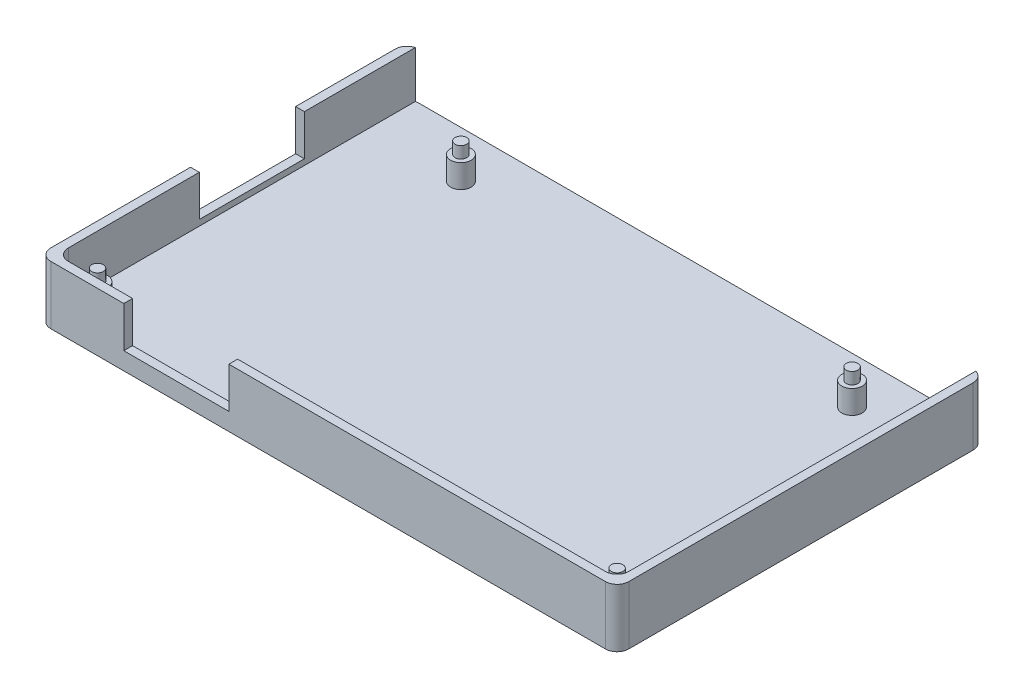
ISO-10303-21;
HEADER;
FILE_DESCRIPTION(('STEP AP214'),'2;1');
FILE_NAME('part.step','',(''),(''),'','','');
FILE_SCHEMA(('AUTOMOTIVE_DESIGN { 1 0 10303 214 1 1 1 1 }'));
ENDSEC;
DATA;
#1=APPLICATION_CONTEXT('core data for automotive mechanical design processes');
#2=APPLICATION_PROTOCOL_DEFINITION('international standard','automotive_design',2000,#1);
#3=PRODUCT_CONTEXT('',#1,'mechanical');
#4=PRODUCT('Part','Part','',(#3));
#5=PRODUCT_RELATED_PRODUCT_CATEGORY('part','',(#4));
#6=PRODUCT_DEFINITION_FORMATION('','',#4);
#7=PRODUCT_DEFINITION_CONTEXT('part definition',#1,'design');
#8=PRODUCT_DEFINITION('design','',#6,#7);
#9=PRODUCT_DEFINITION_SHAPE('','',#8);
#10=(LENGTH_UNIT() NAMED_UNIT(*) SI_UNIT(.MILLI.,.METRE.));
#11=(NAMED_UNIT(*) PLANE_ANGLE_UNIT() SI_UNIT($,.RADIAN.));
#12=(NAMED_UNIT(*) SI_UNIT($,.STERADIAN.) SOLID_ANGLE_UNIT());
#13=UNCERTAINTY_MEASURE_WITH_UNIT(LENGTH_MEASURE(1.E-05),#10,'distance_accuracy_value','');
#14=(GEOMETRIC_REPRESENTATION_CONTEXT(3) GLOBAL_UNCERTAINTY_ASSIGNED_CONTEXT((#13)) GLOBAL_UNIT_ASSIGNED_CONTEXT((#10,
#11,#12)) REPRESENTATION_CONTEXT('',''));
#15=CARTESIAN_POINT('',(0.,0.,0.));
#16=DIRECTION('',(0.,0.,1.));
#17=DIRECTION('',(1.,0.,0.));
#18=AXIS2_PLACEMENT_3D('',#15,#16,#17);
#19=CARTESIAN_POINT('',(-48.75,10.,-31.));
#20=DIRECTION('',(0.,1.,0.));
#21=DIRECTION('',(0.,0.,1.));
#22=AXIS2_PLACEMENT_3D('',#19,#20,#21);
#23=PLANE('',#22);
#24=DIRECTION('',(0.,0.,1.));
#25=VECTOR('',#24,1.);
#26=CARTESIAN_POINT('',(-36.25,10.,-33.001));
#27=LINE('',#26,#25);
#28=CARTESIAN_POINT('',(-36.25,10.,28.5));
#29=VERTEX_POINT('',#28);
#30=CARTESIAN_POINT('',(-36.25,10.,30.));
#31=VERTEX_POINT('',#30);
#32=EDGE_CURVE('E201',#29,#31,#27,.T.);
#33=ORIENTED_EDGE('',*,*,#32,.F.);
#34=DIRECTION('',(-1.,0.,0.));
#35=VECTOR('',#34,1.);
#36=CARTESIAN_POINT('',(-47.25,10.,28.5));
#37=LINE('',#36,#35);
#38=CARTESIAN_POINT('',(-47.25,10.,28.5));
#39=VERTEX_POINT('',#38);
#40=EDGE_CURVE('E206',#29,#39,#37,.T.);
#41=ORIENTED_EDGE('',*,*,#40,.T.);
#42=CARTESIAN_POINT('',(-47.25,10.,26.5));
#43=DIRECTION('',(0.,-1.,0.));
#44=DIRECTION('',(0.,0.,1.));
#45=AXIS2_PLACEMENT_3D('',#42,#43,#44);
#46=CIRCLE('',#45,2.);
#47=CARTESIAN_POINT('',(-49.25,10.,26.5));
#48=VERTEX_POINT('',#47);
#49=EDGE_CURVE('E273',#39,#48,#46,.T.);
#50=ORIENTED_EDGE('',*,*,#49,.T.);
#51=DIRECTION('',(0.,0.,-1.));
#52=VECTOR('',#51,1.);
#53=CARTESIAN_POINT('',(-49.25,10.,26.5));
#54=LINE('',#53,#52);
#55=CARTESIAN_POINT('',(-49.25,10.,4.06350832689628));
#56=VERTEX_POINT('',#55);
#57=EDGE_CURVE('E276',#48,#56,#54,.T.);
#58=ORIENTED_EDGE('',*,*,#57,.T.);
#59=DIRECTION('',(-1.,0.,0.));
#60=VECTOR('',#59,1.);
#61=CARTESIAN_POINT('',(48.251,10.,4.06350832689626));
#62=LINE('',#61,#60);
#63=CARTESIAN_POINT('',(-50.75,10.,4.06350832689628));
#64=VERTEX_POINT('',#63);
#65=EDGE_CURVE('E237',#56,#64,#62,.T.);
#66=ORIENTED_EDGE('',*,*,#65,.T.);
#67=DIRECTION('',(0.,0.,1.));
#68=VECTOR('',#67,1.);
#69=CARTESIAN_POINT('',(-50.75,10.,-31.));
#70=LINE('',#69,#68);
#71=CARTESIAN_POINT('',(-50.75,10.,28.));
#72=VERTEX_POINT('',#71);
#73=EDGE_CURVE('E246',#64,#72,#70,.T.);
#74=ORIENTED_EDGE('',*,*,#73,.T.);
#75=CARTESIAN_POINT('',(-48.75,10.,28.));
#76=DIRECTION('',(0.,1.,0.));
#77=DIRECTION('',(0.,0.,1.));
#78=AXIS2_PLACEMENT_3D('',#75,#76,#77);
#79=CIRCLE('',#78,2.);
#80=CARTESIAN_POINT('',(-48.75,10.,30.));
#81=VERTEX_POINT('',#80);
#82=EDGE_CURVE('E251',#72,#81,#79,.T.);
#83=ORIENTED_EDGE('',*,*,#82,.T.);
#84=DIRECTION('',(1.,0.,0.));
#85=VECTOR('',#84,1.);
#86=CARTESIAN_POINT('',(-48.75,10.,30.));
#87=LINE('',#86,#85);
#88=EDGE_CURVE('E255',#81,#31,#87,.T.);
#89=ORIENTED_EDGE('',*,*,#88,.T.);
#90=EDGE_LOOP('',(#33,#41,#50,#58,#66,#74,#83,#89));
#91=FACE_BOUND('',#90,.T.);
#92=ADVANCED_FACE('F34',(#91),#23,.T.);
#93=DIRECTION('',(0.,0.,1.));
#94=VECTOR('',#93,1.);
#95=CARTESIAN_POINT('',(-18.25,10.,-33.001));
#96=LINE('',#95,#94);
#97=CARTESIAN_POINT('',(-18.25,10.,28.5));
#98=VERTEX_POINT('',#97);
#99=CARTESIAN_POINT('',(-18.25,10.,30.));
#100=VERTEX_POINT('',#99);
#101=EDGE_CURVE('E215',#98,#100,#96,.T.);
#102=ORIENTED_EDGE('',*,*,#101,.T.);
#103=CARTESIAN_POINT('',(46.25,10.,30.));
#104=VERTEX_POINT('',#103);
#105=EDGE_CURVE('E254',#100,#104,#87,.T.);
#106=ORIENTED_EDGE('',*,*,#105,.T.);
#107=CARTESIAN_POINT('',(46.25,10.,28.));
#108=DIRECTION('',(0.,1.,0.));
#109=DIRECTION('',(0.,0.,1.));
#110=AXIS2_PLACEMENT_3D('',#107,#108,#109);
#111=CIRCLE('',#110,2.);
#112=CARTESIAN_POINT('',(48.25,10.,28.));
#113=VERTEX_POINT('',#112);
#114=EDGE_CURVE('E258',#104,#113,#111,.T.);
#115=ORIENTED_EDGE('',*,*,#114,.T.);
#116=DIRECTION('',(0.,0.,-1.));
#117=VECTOR('',#116,1.);
#118=CARTESIAN_POINT('',(48.25,10.,28.));
#119=LINE('',#118,#117);
#120=CARTESIAN_POINT('',(48.25,10.,-31.));
#121=VERTEX_POINT('',#120);
#122=EDGE_CURVE('E261',#113,#121,#119,.T.);
#123=ORIENTED_EDGE('',*,*,#122,.T.);
#124=CARTESIAN_POINT('',(46.25,10.,-31.));
#125=DIRECTION('',(0.,1.,0.));
#126=DIRECTION('',(0.,0.,1.));
#127=AXIS2_PLACEMENT_3D('',#124,#125,#126);
#128=CIRCLE('',#127,2.);
#129=CARTESIAN_POINT('',(46.75,10.,-32.9364916731037));
#130=VERTEX_POINT('',#129);
#131=EDGE_CURVE('E264',#121,#130,#128,.T.);
#132=ORIENTED_EDGE('',*,*,#131,.T.);
#133=DIRECTION('',(0.,0.,1.));
#134=VECTOR('',#133,1.);
#135=CARTESIAN_POINT('',(46.75,10.,26.5));
#136=LINE('',#135,#134);
#137=CARTESIAN_POINT('',(46.75,10.,26.5));
#138=VERTEX_POINT('',#137);
#139=EDGE_CURVE('E266',#130,#138,#136,.T.);
#140=ORIENTED_EDGE('',*,*,#139,.T.);
#141=CARTESIAN_POINT('',(44.75,10.,26.5));
#142=DIRECTION('',(0.,-1.,0.));
#143=DIRECTION('',(0.,0.,1.));
#144=AXIS2_PLACEMENT_3D('',#141,#142,#143);
#145=CIRCLE('',#144,2.);
#146=CARTESIAN_POINT('',(44.75,10.,28.5));
#147=VERTEX_POINT('',#146);
#148=EDGE_CURVE('E268',#138,#147,#145,.T.);
#149=ORIENTED_EDGE('',*,*,#148,.T.);
#150=EDGE_CURVE('E270',#147,#98,#37,.T.);
#151=ORIENTED_EDGE('',*,*,#150,.T.);
#152=EDGE_LOOP('',(#102,#106,#115,#123,#132,#140,#149,#151));
#153=FACE_BOUND('',#152,.T.);
#154=ADVANCED_FACE('F409',(#153),#23,.T.);
#155=CARTESIAN_POINT('',(0.,2.,0.));
#156=DIRECTION('',(0.,1.,0.));
#157=DIRECTION('',(0.,0.,1.));
#158=AXIS2_PLACEMENT_3D('',#155,#156,#157);
#159=PLANE('',#158);
#160=CARTESIAN_POINT('',(43.25,2.,25.));
#161=DIRECTION('',(0.,1.,0.));
#162=DIRECTION('',(0.,0.,1.));
#163=AXIS2_PLACEMENT_3D('',#160,#161,#162);
#164=CIRCLE('',#163,1.75);
#165=CARTESIAN_POINT('',(43.25,2.,26.75));
#166=VERTEX_POINT('',#165);
#167=EDGE_CURVE('E317',#166,#166,#164,.F.);
#168=ORIENTED_EDGE('',*,*,#167,.T.);
#169=EDGE_LOOP('',(#168));
#170=FACE_BOUND('',#169,.T.);
#171=CARTESIAN_POINT('',(-45.75,2.,25.));
#172=DIRECTION('',(0.,1.,0.));
#173=DIRECTION('',(0.,0.,1.));
#174=AXIS2_PLACEMENT_3D('',#171,#172,#173);
#175=CIRCLE('',#174,1.75);
#176=CARTESIAN_POINT('',(-45.75,2.,26.75));
#177=VERTEX_POINT('',#176);
#178=EDGE_CURVE('E329',#177,#177,#175,.F.);
#179=ORIENTED_EDGE('',*,*,#178,.T.);
#180=EDGE_LOOP('',(#179));
#181=FACE_BOUND('',#180,.T.);
#182=CARTESIAN_POINT('',(33.5,2.,-25.));
#183=DIRECTION('',(0.,1.,0.));
#184=DIRECTION('',(0.,0.,1.));
#185=AXIS2_PLACEMENT_3D('',#182,#183,#184);
#186=CIRCLE('',#185,1.75);
#187=CARTESIAN_POINT('',(33.5,2.,-23.25));
#188=VERTEX_POINT('',#187);
#189=EDGE_CURVE('E341',#188,#188,#186,.F.);
#190=ORIENTED_EDGE('',*,*,#189,.T.);
#191=EDGE_LOOP('',(#190));
#192=FACE_BOUND('',#191,.T.);
#193=CARTESIAN_POINT('',(-33.5,2.,-25.));
#194=DIRECTION('',(0.,1.,0.));
#195=DIRECTION('',(0.,0.,1.));
#196=AXIS2_PLACEMENT_3D('',#193,#194,#195);
#197=CIRCLE('',#196,1.75);
#198=CARTESIAN_POINT('',(-33.5,2.,-23.25));
#199=VERTEX_POINT('',#198);
#200=EDGE_CURVE('E350',#199,#199,#197,.T.);
#201=ORIENTED_EDGE('',*,*,#200,.F.);
#202=EDGE_LOOP('',(#201));
#203=FACE_BOUND('',#202,.T.);
#204=CARTESIAN_POINT('',(44.75,2.,26.5));
#205=DIRECTION('',(0.,-1.,0.));
#206=DIRECTION('',(0.,0.,1.));
#207=AXIS2_PLACEMENT_3D('',#204,#205,#206);
#208=CIRCLE('',#207,2.);
#209=CARTESIAN_POINT('',(46.75,2.,26.5));
#210=VERTEX_POINT('',#209);
#211=CARTESIAN_POINT('',(44.75,2.,28.5));
#212=VERTEX_POINT('',#211);
#213=EDGE_CURVE('E282',#210,#212,#208,.T.);
#214=ORIENTED_EDGE('',*,*,#213,.F.);
#215=DIRECTION('',(0.,0.,1.));
#216=VECTOR('',#215,1.);
#217=CARTESIAN_POINT('',(46.75,2.,26.5));
#218=LINE('',#217,#216);
#219=CARTESIAN_POINT('',(46.75,2.,-32.9364916731037));
#220=VERTEX_POINT('',#219);
#221=EDGE_CURVE('E242',#220,#210,#218,.T.);
#222=ORIENTED_EDGE('',*,*,#221,.F.);
#223=CARTESIAN_POINT('',(46.25,2.,-31.));
#224=DIRECTION('',(0.,1.,0.));
#225=DIRECTION('',(0.,0.,1.));
#226=AXIS2_PLACEMENT_3D('',#223,#224,#225);
#227=CIRCLE('',#226,2.);
#228=CARTESIAN_POINT('',(46.25,2.,-33.));
#229=VERTEX_POINT('',#228);
#230=EDGE_CURVE('E392',#220,#229,#227,.T.);
#231=ORIENTED_EDGE('',*,*,#230,.T.);
#232=DIRECTION('',(-1.,0.,0.));
#233=VECTOR('',#232,1.);
#234=CARTESIAN_POINT('',(-50.75,2.,-33.));
#235=LINE('',#234,#233);
#236=CARTESIAN_POINT('',(-48.75,2.,-33.));
#237=VERTEX_POINT('',#236);
#238=EDGE_CURVE('E347',#229,#237,#235,.T.);
#239=ORIENTED_EDGE('',*,*,#238,.T.);
#240=CARTESIAN_POINT('',(-48.75,2.,-31.));
#241=DIRECTION('',(0.,1.,0.));
#242=DIRECTION('',(0.,0.,1.));
#243=AXIS2_PLACEMENT_3D('',#240,#241,#242);
#244=CIRCLE('',#243,2.);
#245=CARTESIAN_POINT('',(-49.25,2.,-32.9364916731037));
#246=VERTEX_POINT('',#245);
#247=EDGE_CURVE('E394',#237,#246,#244,.T.);
#248=ORIENTED_EDGE('',*,*,#247,.T.);
#249=DIRECTION('',(0.,0.,-1.));
#250=VECTOR('',#249,1.);
#251=CARTESIAN_POINT('',(-49.25,2.,26.5));
#252=LINE('',#251,#250);
#253=CARTESIAN_POINT('',(-49.25,2.,26.5));
#254=VERTEX_POINT('',#253);
#255=EDGE_CURVE('E247',#254,#246,#252,.T.);
#256=ORIENTED_EDGE('',*,*,#255,.F.);
#257=CARTESIAN_POINT('',(-47.25,2.,26.5));
#258=DIRECTION('',(0.,-1.,0.));
#259=DIRECTION('',(0.,0.,1.));
#260=AXIS2_PLACEMENT_3D('',#257,#258,#259);
#261=CIRCLE('',#260,2.);
#262=CARTESIAN_POINT('',(-47.25,2.,28.5));
#263=VERTEX_POINT('',#262);
#264=EDGE_CURVE('E288',#263,#254,#261,.T.);
#265=ORIENTED_EDGE('',*,*,#264,.F.);
#266=DIRECTION('',(-1.,0.,0.));
#267=VECTOR('',#266,1.);
#268=CARTESIAN_POINT('',(-47.25,2.,28.5));
#269=LINE('',#268,#267);
#270=EDGE_CURVE('E285',#212,#263,#269,.T.);
#271=ORIENTED_EDGE('',*,*,#270,.F.);
#272=EDGE_LOOP('',(#214,#222,#231,#239,#248,#256,#265,#271));
#273=FACE_BOUND('',#272,.T.);
#274=ADVANCED_FACE('F449',(#170,#181,#192,#203,#273),#159,.T.);
#275=CARTESIAN_POINT('',(-33.5,8.,-25.));
#276=DIRECTION('',(0.,-1.,0.));
#277=DIRECTION('',(0.,0.,-1.));
#278=AXIS2_PLACEMENT_3D('',#275,#276,#277);
#279=CYLINDRICAL_SURFACE('',#278,0.999999999999998);
#280=CARTESIAN_POINT('',(-33.5,6.,-25.));
#281=DIRECTION('',(0.,1.,0.));
#282=DIRECTION('',(0.,0.,1.));
#283=AXIS2_PLACEMENT_3D('',#280,#281,#282);
#284=CIRCLE('',#283,0.999999999999998);
#285=CARTESIAN_POINT('',(-33.5,6.,-24.));
#286=VERTEX_POINT('',#285);
#287=EDGE_CURVE('E365',#286,#286,#284,.T.);
#288=ORIENTED_EDGE('',*,*,#287,.T.);
#289=EDGE_LOOP('',(#288));
#290=FACE_BOUND('',#289,.T.);
#291=CARTESIAN_POINT('',(-33.5,8.,-25.));
#292=DIRECTION('',(0.,1.,0.));
#293=DIRECTION('',(0.,0.,1.));
#294=AXIS2_PLACEMENT_3D('',#291,#292,#293);
#295=CIRCLE('',#294,0.999999999999998);
#296=CARTESIAN_POINT('',(-33.5,8.,-24.));
#297=VERTEX_POINT('',#296);
#298=EDGE_CURVE('E366',#297,#297,#295,.T.);
#299=ORIENTED_EDGE('',*,*,#298,.F.);
#300=EDGE_LOOP('',(#299));
#301=FACE_BOUND('',#300,.T.);
#302=ADVANCED_FACE('F550',(#290,#301),#279,.T.);
#303=CARTESIAN_POINT('',(-33.5,8.,-25.));
#304=DIRECTION('',(0.,1.,0.));
#305=DIRECTION('',(0.,0.,1.));
#306=AXIS2_PLACEMENT_3D('',#303,#304,#305);
#307=PLANE('',#306);
#308=ORIENTED_EDGE('',*,*,#298,.T.);
#309=EDGE_LOOP('',(#308));
#310=FACE_BOUND('',#309,.T.);
#311=ADVANCED_FACE('F567',(#310),#307,.T.);
#312=CARTESIAN_POINT('',(-33.5,6.,-25.));
#313=DIRECTION('',(0.,-1.,0.));
#314=DIRECTION('',(0.,0.,-1.));
#315=AXIS2_PLACEMENT_3D('',#312,#313,#314);
#316=CYLINDRICAL_SURFACE('',#315,1.75);
#317=ORIENTED_EDGE('',*,*,#200,.T.);
#318=EDGE_LOOP('',(#317));
#319=FACE_BOUND('',#318,.T.);
#320=CARTESIAN_POINT('',(-33.5,6.,-25.));
#321=DIRECTION('',(0.,1.,0.));
#322=DIRECTION('',(0.,0.,1.));
#323=AXIS2_PLACEMENT_3D('',#320,#321,#322);
#324=CIRCLE('',#323,1.75);
#325=CARTESIAN_POINT('',(-33.5,6.,-23.25));
#326=VERTEX_POINT('',#325);
#327=EDGE_CURVE('E362',#326,#326,#324,.T.);
#328=ORIENTED_EDGE('',*,*,#327,.F.);
#329=EDGE_LOOP('',(#328));
#330=FACE_BOUND('',#329,.T.);
#331=ADVANCED_FACE('F563',(#319,#330),#316,.T.);
#332=CARTESIAN_POINT('',(-33.5,6.,-25.));
#333=DIRECTION('',(0.,1.,0.));
#334=DIRECTION('',(0.,0.,1.));
#335=AXIS2_PLACEMENT_3D('',#332,#333,#334);
#336=PLANE('',#335);
#337=ORIENTED_EDGE('',*,*,#287,.F.);
#338=EDGE_LOOP('',(#337));
#339=FACE_BOUND('',#338,.T.);
#340=ORIENTED_EDGE('',*,*,#327,.T.);
#341=EDGE_LOOP('',(#340));
#342=FACE_BOUND('',#341,.T.);
#343=ADVANCED_FACE('F560',(#339,#342),#336,.T.);
#344=CARTESIAN_POINT('',(-50.75,2.,-33.));
#345=DIRECTION('',(1.,0.,0.));
#346=DIRECTION('',(0.,0.,-1.));
#347=AXIS2_PLACEMENT_3D('',#344,#345,#346);
#348=PLANE('',#347);
#349=ORIENTED_EDGE('',*,*,#73,.F.);
#350=DIRECTION('',(0.,1.,0.));
#351=VECTOR('',#350,1.);
#352=CARTESIAN_POINT('',(-50.75,10.,4.06350832689628));
#353=LINE('',#352,#351);
#354=CARTESIAN_POINT('',(-50.75,3.,4.06350832689628));
#355=VERTEX_POINT('',#354);
#356=EDGE_CURVE('E221',#355,#64,#353,.T.);
#357=ORIENTED_EDGE('',*,*,#356,.F.);
#358=DIRECTION('',(0.,0.,1.));
#359=VECTOR('',#358,1.);
#360=CARTESIAN_POINT('',(-50.75,3.,-13.9364916731037));
#361=LINE('',#360,#359);
#362=CARTESIAN_POINT('',(-50.75,3.,-13.9364916731037));
#363=VERTEX_POINT('',#362);
#364=EDGE_CURVE('E224',#363,#355,#361,.T.);
#365=ORIENTED_EDGE('',*,*,#364,.F.);
#366=DIRECTION('',(0.,-1.,0.));
#367=VECTOR('',#366,1.);
#368=CARTESIAN_POINT('',(-50.75,10.,-13.9364916731037));
#369=LINE('',#368,#367);
#370=CARTESIAN_POINT('',(-50.75,10.,-13.9364916731037));
#371=VERTEX_POINT('',#370);
#372=EDGE_CURVE('E227',#371,#363,#369,.T.);
#373=ORIENTED_EDGE('',*,*,#372,.F.);
#374=CARTESIAN_POINT('',(-50.75,10.,-31.));
#375=VERTEX_POINT('',#374);
#376=EDGE_CURVE('E248',#375,#371,#70,.T.);
#377=ORIENTED_EDGE('',*,*,#376,.F.);
#378=DIRECTION('',(0.,-1.,0.));
#379=VECTOR('',#378,1.);
#380=CARTESIAN_POINT('',(-50.75,2.,-31.));
#381=LINE('',#380,#379);
#382=CARTESIAN_POINT('',(-50.75,0.,-31.));
#383=VERTEX_POINT('',#382);
#384=EDGE_CURVE('E376',#375,#383,#381,.T.);
#385=ORIENTED_EDGE('',*,*,#384,.T.);
#386=DIRECTION('',(0.,0.,1.));
#387=VECTOR('',#386,1.);
#388=CARTESIAN_POINT('',(-50.75,0.,-33.));
#389=LINE('',#388,#387);
#390=CARTESIAN_POINT('',(-50.75,0.,28.));
#391=VERTEX_POINT('',#390);
#392=EDGE_CURVE('E346',#383,#391,#389,.T.);
#393=ORIENTED_EDGE('',*,*,#392,.T.);
#394=DIRECTION('',(0.,-1.,0.));
#395=VECTOR('',#394,1.);
#396=CARTESIAN_POINT('',(-50.75,2.,28.));
#397=LINE('',#396,#395);
#398=EDGE_CURVE('E369',#391,#72,#397,.F.);
#399=ORIENTED_EDGE('',*,*,#398,.T.);
#400=EDGE_LOOP('',(#349,#357,#365,#373,#377,#385,#393,#399));
#401=FACE_BOUND('',#400,.T.);
#402=ADVANCED_FACE('F464',(#401),#348,.F.);
#403=CARTESIAN_POINT('',(-50.75,2.,30.));
#404=DIRECTION('',(0.,0.,-1.));
#405=DIRECTION('',(-1.,0.,0.));
#406=AXIS2_PLACEMENT_3D('',#403,#404,#405);
#407=PLANE('',#406);
#408=DIRECTION('',(1.,0.,0.));
#409=VECTOR('',#408,1.);
#410=CARTESIAN_POINT('',(-36.25,3.,30.));
#411=LINE('',#410,#409);
#412=CARTESIAN_POINT('',(-36.25,3.,30.));
#413=VERTEX_POINT('',#412);
#414=CARTESIAN_POINT('',(-18.25,3.,30.));
#415=VERTEX_POINT('',#414);
#416=EDGE_CURVE('E208',#413,#415,#411,.T.);
#417=ORIENTED_EDGE('',*,*,#416,.F.);
#418=DIRECTION('',(0.,-1.,0.));
#419=VECTOR('',#418,1.);
#420=CARTESIAN_POINT('',(-36.25,3.,30.));
#421=LINE('',#420,#419);
#422=EDGE_CURVE('E189',#31,#413,#421,.T.);
#423=ORIENTED_EDGE('',*,*,#422,.F.);
#424=ORIENTED_EDGE('',*,*,#88,.F.);
#425=DIRECTION('',(0.,-1.,0.));
#426=VECTOR('',#425,1.);
#427=CARTESIAN_POINT('',(-48.75,2.,30.));
#428=LINE('',#427,#426);
#429=CARTESIAN_POINT('',(-48.75,0.,30.));
#430=VERTEX_POINT('',#429);
#431=EDGE_CURVE('E399',#81,#430,#428,.T.);
#432=ORIENTED_EDGE('',*,*,#431,.T.);
#433=DIRECTION('',(1.,0.,0.));
#434=VECTOR('',#433,1.);
#435=CARTESIAN_POINT('',(-50.75,0.,30.));
#436=LINE('',#435,#434);
#437=CARTESIAN_POINT('',(46.25,0.,30.));
#438=VERTEX_POINT('',#437);
#439=EDGE_CURVE('E354',#430,#438,#436,.T.);
#440=ORIENTED_EDGE('',*,*,#439,.T.);
#441=DIRECTION('',(0.,-1.,0.));
#442=VECTOR('',#441,1.);
#443=CARTESIAN_POINT('',(46.25,2.,30.));
#444=LINE('',#443,#442);
#445=EDGE_CURVE('E396',#438,#104,#444,.F.);
#446=ORIENTED_EDGE('',*,*,#445,.T.);
#447=ORIENTED_EDGE('',*,*,#105,.F.);
#448=DIRECTION('',(0.,1.,0.));
#449=VECTOR('',#448,1.);
#450=CARTESIAN_POINT('',(-18.25,3.,30.));
#451=LINE('',#450,#449);
#452=EDGE_CURVE('E194',#415,#100,#451,.T.);
#453=ORIENTED_EDGE('',*,*,#452,.F.);
#454=EDGE_LOOP('',(#417,#423,#424,#432,#440,#446,#447,#453));
#455=FACE_BOUND('',#454,.T.);
#456=ADVANCED_FACE('F432',(#455),#407,.F.);
#457=CARTESIAN_POINT('',(48.25,2.,-33.));
#458=DIRECTION('',(-1.,0.,0.));
#459=DIRECTION('',(0.,0.,1.));
#460=AXIS2_PLACEMENT_3D('',#457,#458,#459);
#461=PLANE('',#460);
#462=DIRECTION('',(0.,-1.,0.));
#463=VECTOR('',#462,1.);
#464=CARTESIAN_POINT('',(48.25,2.,-31.));
#465=LINE('',#464,#463);
#466=CARTESIAN_POINT('',(48.25,0.,-31.));
#467=VERTEX_POINT('',#466);
#468=EDGE_CURVE('E42',#467,#121,#465,.F.);
#469=ORIENTED_EDGE('',*,*,#468,.T.);
#470=ORIENTED_EDGE('',*,*,#122,.F.);
#471=DIRECTION('',(0.,-1.,0.));
#472=VECTOR('',#471,1.);
#473=CARTESIAN_POINT('',(48.25,2.,28.));
#474=LINE('',#473,#472);
#475=CARTESIAN_POINT('',(48.25,0.,28.));
#476=VERTEX_POINT('',#475);
#477=EDGE_CURVE('E11',#113,#476,#474,.T.);
#478=ORIENTED_EDGE('',*,*,#477,.T.);
#479=DIRECTION('',(0.,0.,-1.));
#480=VECTOR('',#479,1.);
#481=CARTESIAN_POINT('',(48.25,0.,-33.));
#482=LINE('',#481,#480);
#483=EDGE_CURVE('E357',#476,#467,#482,.T.);
#484=ORIENTED_EDGE('',*,*,#483,.T.);
#485=EDGE_LOOP('',(#469,#470,#478,#484));
#486=FACE_BOUND('',#485,.T.);
#487=ADVANCED_FACE('F404',(#486),#461,.F.);
#488=CARTESIAN_POINT('',(-50.75,2.,-33.));
#489=DIRECTION('',(0.,0.,1.));
#490=DIRECTION('',(1.,0.,0.));
#491=AXIS2_PLACEMENT_3D('',#488,#489,#490);
#492=PLANE('',#491);
#493=DIRECTION('',(-1.,0.,0.));
#494=VECTOR('',#493,1.);
#495=CARTESIAN_POINT('',(-50.75,0.,-33.));
#496=LINE('',#495,#494);
#497=CARTESIAN_POINT('',(46.25,0.,-33.));
#498=VERTEX_POINT('',#497);
#499=CARTESIAN_POINT('',(-48.75,0.,-33.));
#500=VERTEX_POINT('',#499);
#501=EDGE_CURVE('E351',#498,#500,#496,.T.);
#502=ORIENTED_EDGE('',*,*,#501,.T.);
#503=DIRECTION('',(0.,-1.,0.));
#504=VECTOR('',#503,1.);
#505=CARTESIAN_POINT('',(-48.75,2.,-33.));
#506=LINE('',#505,#504);
#507=EDGE_CURVE('E390',#500,#237,#506,.F.);
#508=ORIENTED_EDGE('',*,*,#507,.T.);
#509=ORIENTED_EDGE('',*,*,#238,.F.);
#510=DIRECTION('',(0.,-1.,0.));
#511=VECTOR('',#510,1.);
#512=CARTESIAN_POINT('',(46.25,2.,-33.));
#513=LINE('',#512,#511);
#514=EDGE_CURVE('E387',#229,#498,#513,.T.);
#515=ORIENTED_EDGE('',*,*,#514,.T.);
#516=EDGE_LOOP('',(#502,#508,#509,#515));
#517=FACE_BOUND('',#516,.T.);
#518=ADVANCED_FACE('F446',(#517),#492,.F.);
#519=CARTESIAN_POINT('',(-33.5,0.,-25.));
#520=DIRECTION('',(0.,1.,0.));
#521=DIRECTION('',(0.,0.,1.));
#522=AXIS2_PLACEMENT_3D('',#519,#520,#521);
#523=PLANE('',#522);
#524=ORIENTED_EDGE('',*,*,#392,.F.);
#525=CARTESIAN_POINT('',(-48.75,0.,-31.));
#526=DIRECTION('',(0.,1.,0.));
#527=DIRECTION('',(0.,0.,1.));
#528=AXIS2_PLACEMENT_3D('',#525,#526,#527);
#529=CIRCLE('',#528,2.);
#530=EDGE_CURVE('E385',#383,#500,#529,.F.);
#531=ORIENTED_EDGE('',*,*,#530,.T.);
#532=ORIENTED_EDGE('',*,*,#501,.F.);
#533=CARTESIAN_POINT('',(46.25,0.,-31.));
#534=DIRECTION('',(0.,1.,0.));
#535=DIRECTION('',(0.,0.,1.));
#536=AXIS2_PLACEMENT_3D('',#533,#534,#535);
#537=CIRCLE('',#536,2.);
#538=EDGE_CURVE('E379',#498,#467,#537,.F.);
#539=ORIENTED_EDGE('',*,*,#538,.T.);
#540=ORIENTED_EDGE('',*,*,#483,.F.);
#541=CARTESIAN_POINT('',(46.25,0.,28.));
#542=DIRECTION('',(0.,1.,0.));
#543=DIRECTION('',(0.,0.,1.));
#544=AXIS2_PLACEMENT_3D('',#541,#542,#543);
#545=CIRCLE('',#544,2.);
#546=EDGE_CURVE('E381',#476,#438,#545,.F.);
#547=ORIENTED_EDGE('',*,*,#546,.T.);
#548=ORIENTED_EDGE('',*,*,#439,.F.);
#549=CARTESIAN_POINT('',(-48.75,0.,28.));
#550=DIRECTION('',(0.,1.,0.));
#551=DIRECTION('',(0.,0.,1.));
#552=AXIS2_PLACEMENT_3D('',#549,#550,#551);
#553=CIRCLE('',#552,2.);
#554=EDGE_CURVE('E383',#430,#391,#553,.F.);
#555=ORIENTED_EDGE('',*,*,#554,.T.);
#556=EDGE_LOOP('',(#524,#531,#532,#539,#540,#547,#548,#555));
#557=FACE_BOUND('',#556,.T.);
#558=ADVANCED_FACE('F442',(#557),#523,.F.);
#559=CARTESIAN_POINT('',(33.5,8.,-25.));
#560=DIRECTION('',(0.,-1.,0.));
#561=DIRECTION('',(0.,0.,-1.));
#562=AXIS2_PLACEMENT_3D('',#559,#560,#561);
#563=CYLINDRICAL_SURFACE('',#562,0.999999999999998);
#564=CARTESIAN_POINT('',(33.5,6.,-25.));
#565=DIRECTION('',(0.,1.,0.));
#566=DIRECTION('',(0.,0.,1.));
#567=AXIS2_PLACEMENT_3D('',#564,#565,#566);
#568=CIRCLE('',#567,0.999999999999998);
#569=CARTESIAN_POINT('',(33.5,6.,-24.));
#570=VERTEX_POINT('',#569);
#571=EDGE_CURVE('E337',#570,#570,#568,.T.);
#572=ORIENTED_EDGE('',*,*,#571,.T.);
#573=EDGE_LOOP('',(#572));
#574=FACE_BOUND('',#573,.T.);
#575=CARTESIAN_POINT('',(33.5,8.,-25.));
#576=DIRECTION('',(0.,1.,0.));
#577=DIRECTION('',(0.,0.,1.));
#578=AXIS2_PLACEMENT_3D('',#575,#576,#577);
#579=CIRCLE('',#578,0.999999999999998);
#580=CARTESIAN_POINT('',(33.5,8.,-24.));
#581=VERTEX_POINT('',#580);
#582=EDGE_CURVE('E338',#581,#581,#579,.T.);
#583=ORIENTED_EDGE('',*,*,#582,.F.);
#584=EDGE_LOOP('',(#583));
#585=FACE_BOUND('',#584,.T.);
#586=ADVANCED_FACE('F543',(#574,#585),#563,.T.);
#587=CARTESIAN_POINT('',(33.5,8.,-25.));
#588=DIRECTION('',(0.,1.,0.));
#589=DIRECTION('',(0.,0.,1.));
#590=AXIS2_PLACEMENT_3D('',#587,#588,#589);
#591=PLANE('',#590);
#592=ORIENTED_EDGE('',*,*,#582,.T.);
#593=EDGE_LOOP('',(#592));
#594=FACE_BOUND('',#593,.T.);
#595=ADVANCED_FACE('F539',(#594),#591,.T.);
#596=CARTESIAN_POINT('',(33.5,6.,-25.));
#597=DIRECTION('',(0.,-1.,0.));
#598=DIRECTION('',(0.,0.,-1.));
#599=AXIS2_PLACEMENT_3D('',#596,#597,#598);
#600=CYLINDRICAL_SURFACE('',#599,1.75);
#601=ORIENTED_EDGE('',*,*,#189,.F.);
#602=EDGE_LOOP('',(#601));
#603=FACE_BOUND('',#602,.T.);
#604=CARTESIAN_POINT('',(33.5,6.,-25.));
#605=DIRECTION('',(0.,1.,0.));
#606=DIRECTION('',(0.,0.,1.));
#607=AXIS2_PLACEMENT_3D('',#604,#605,#606);
#608=CIRCLE('',#607,1.75);
#609=CARTESIAN_POINT('',(33.5,6.,-23.25));
#610=VERTEX_POINT('',#609);
#611=EDGE_CURVE('E334',#610,#610,#608,.T.);
#612=ORIENTED_EDGE('',*,*,#611,.F.);
#613=EDGE_LOOP('',(#612));
#614=FACE_BOUND('',#613,.T.);
#615=ADVANCED_FACE('F535',(#603,#614),#600,.T.);
#616=CARTESIAN_POINT('',(33.5,6.,-25.));
#617=DIRECTION('',(0.,1.,0.));
#618=DIRECTION('',(0.,0.,1.));
#619=AXIS2_PLACEMENT_3D('',#616,#617,#618);
#620=PLANE('',#619);
#621=ORIENTED_EDGE('',*,*,#571,.F.);
#622=EDGE_LOOP('',(#621));
#623=FACE_BOUND('',#622,.T.);
#624=ORIENTED_EDGE('',*,*,#611,.T.);
#625=EDGE_LOOP('',(#624));
#626=FACE_BOUND('',#625,.T.);
#627=ADVANCED_FACE('F531',(#623,#626),#620,.T.);
#628=CARTESIAN_POINT('',(-45.75,8.,25.));
#629=DIRECTION('',(0.,-1.,0.));
#630=DIRECTION('',(0.,0.,-1.));
#631=AXIS2_PLACEMENT_3D('',#628,#629,#630);
#632=CYLINDRICAL_SURFACE('',#631,0.999999999999998);
#633=CARTESIAN_POINT('',(-45.75,6.,25.));
#634=DIRECTION('',(0.,1.,0.));
#635=DIRECTION('',(0.,0.,1.));
#636=AXIS2_PLACEMENT_3D('',#633,#634,#635);
#637=CIRCLE('',#636,0.999999999999998);
#638=CARTESIAN_POINT('',(-45.75,6.,26.));
#639=VERTEX_POINT('',#638);
#640=EDGE_CURVE('E325',#639,#639,#637,.T.);
#641=ORIENTED_EDGE('',*,*,#640,.T.);
#642=EDGE_LOOP('',(#641));
#643=FACE_BOUND('',#642,.T.);
#644=CARTESIAN_POINT('',(-45.75,8.,25.));
#645=DIRECTION('',(0.,1.,0.));
#646=DIRECTION('',(0.,0.,1.));
#647=AXIS2_PLACEMENT_3D('',#644,#645,#646);
#648=CIRCLE('',#647,0.999999999999998);
#649=CARTESIAN_POINT('',(-45.75,8.,26.));
#650=VERTEX_POINT('',#649);
#651=EDGE_CURVE('E326',#650,#650,#648,.T.);
#652=ORIENTED_EDGE('',*,*,#651,.F.);
#653=EDGE_LOOP('',(#652));
#654=FACE_BOUND('',#653,.T.);
#655=ADVANCED_FACE('F527',(#643,#654),#632,.T.);
#656=CARTESIAN_POINT('',(-45.75,8.,25.));
#657=DIRECTION('',(0.,1.,0.));
#658=DIRECTION('',(0.,0.,1.));
#659=AXIS2_PLACEMENT_3D('',#656,#657,#658);
#660=PLANE('',#659);
#661=ORIENTED_EDGE('',*,*,#651,.T.);
#662=EDGE_LOOP('',(#661));
#663=FACE_BOUND('',#662,.T.);
#664=ADVANCED_FACE('F523',(#663),#660,.T.);
#665=CARTESIAN_POINT('',(-45.75,6.,25.));
#666=DIRECTION('',(0.,-1.,0.));
#667=DIRECTION('',(0.,0.,-1.));
#668=AXIS2_PLACEMENT_3D('',#665,#666,#667);
#669=CYLINDRICAL_SURFACE('',#668,1.75);
#670=ORIENTED_EDGE('',*,*,#178,.F.);
#671=EDGE_LOOP('',(#670));
#672=FACE_BOUND('',#671,.T.);
#673=CARTESIAN_POINT('',(-45.75,6.,25.));
#674=DIRECTION('',(0.,1.,0.));
#675=DIRECTION('',(0.,0.,1.));
#676=AXIS2_PLACEMENT_3D('',#673,#674,#675);
#677=CIRCLE('',#676,1.75);
#678=CARTESIAN_POINT('',(-45.75,6.,26.75));
#679=VERTEX_POINT('',#678);
#680=EDGE_CURVE('E322',#679,#679,#677,.T.);
#681=ORIENTED_EDGE('',*,*,#680,.F.);
#682=EDGE_LOOP('',(#681));
#683=FACE_BOUND('',#682,.T.);
#684=ADVANCED_FACE('F519',(#672,#683),#669,.T.);
#685=CARTESIAN_POINT('',(-45.75,6.,25.));
#686=DIRECTION('',(0.,1.,0.));
#687=DIRECTION('',(0.,0.,1.));
#688=AXIS2_PLACEMENT_3D('',#685,#686,#687);
#689=PLANE('',#688);
#690=ORIENTED_EDGE('',*,*,#640,.F.);
#691=EDGE_LOOP('',(#690));
#692=FACE_BOUND('',#691,.T.);
#693=ORIENTED_EDGE('',*,*,#680,.T.);
#694=EDGE_LOOP('',(#693));
#695=FACE_BOUND('',#694,.T.);
#696=ADVANCED_FACE('F515',(#692,#695),#689,.T.);
#697=CARTESIAN_POINT('',(43.25,8.,25.));
#698=DIRECTION('',(0.,-1.,0.));
#699=DIRECTION('',(0.,0.,-1.));
#700=AXIS2_PLACEMENT_3D('',#697,#698,#699);
#701=CYLINDRICAL_SURFACE('',#700,0.999999999999998);
#702=CARTESIAN_POINT('',(43.25,6.,25.));
#703=DIRECTION('',(0.,1.,0.));
#704=DIRECTION('',(0.,0.,1.));
#705=AXIS2_PLACEMENT_3D('',#702,#703,#704);
#706=CIRCLE('',#705,0.999999999999998);
#707=CARTESIAN_POINT('',(43.25,6.,26.));
#708=VERTEX_POINT('',#707);
#709=EDGE_CURVE('E313',#708,#708,#706,.T.);
#710=ORIENTED_EDGE('',*,*,#709,.T.);
#711=EDGE_LOOP('',(#710));
#712=FACE_BOUND('',#711,.T.);
#713=CARTESIAN_POINT('',(43.25,8.,25.));
#714=DIRECTION('',(0.,1.,0.));
#715=DIRECTION('',(0.,0.,1.));
#716=AXIS2_PLACEMENT_3D('',#713,#714,#715);
#717=CIRCLE('',#716,0.999999999999998);
#718=CARTESIAN_POINT('',(43.25,8.,26.));
#719=VERTEX_POINT('',#718);
#720=EDGE_CURVE('E314',#719,#719,#717,.T.);
#721=ORIENTED_EDGE('',*,*,#720,.F.);
#722=EDGE_LOOP('',(#721));
#723=FACE_BOUND('',#722,.T.);
#724=ADVANCED_FACE('F511',(#712,#723),#701,.T.);
#725=CARTESIAN_POINT('',(43.25,8.,25.));
#726=DIRECTION('',(0.,1.,0.));
#727=DIRECTION('',(0.,0.,1.));
#728=AXIS2_PLACEMENT_3D('',#725,#726,#727);
#729=PLANE('',#728);
#730=ORIENTED_EDGE('',*,*,#720,.T.);
#731=EDGE_LOOP('',(#730));
#732=FACE_BOUND('',#731,.T.);
#733=ADVANCED_FACE('F507',(#732),#729,.T.);
#734=CARTESIAN_POINT('',(43.25,6.,25.));
#735=DIRECTION('',(0.,-1.,0.));
#736=DIRECTION('',(0.,0.,-1.));
#737=AXIS2_PLACEMENT_3D('',#734,#735,#736);
#738=CYLINDRICAL_SURFACE('',#737,1.75);
#739=ORIENTED_EDGE('',*,*,#167,.F.);
#740=EDGE_LOOP('',(#739));
#741=FACE_BOUND('',#740,.T.);
#742=CARTESIAN_POINT('',(43.25,6.,25.));
#743=DIRECTION('',(0.,1.,0.));
#744=DIRECTION('',(0.,0.,1.));
#745=AXIS2_PLACEMENT_3D('',#742,#743,#744);
#746=CIRCLE('',#745,1.75);
#747=CARTESIAN_POINT('',(43.25,6.,26.75));
#748=VERTEX_POINT('',#747);
#749=EDGE_CURVE('E310',#748,#748,#746,.T.);
#750=ORIENTED_EDGE('',*,*,#749,.F.);
#751=EDGE_LOOP('',(#750));
#752=FACE_BOUND('',#751,.T.);
#753=ADVANCED_FACE('F503',(#741,#752),#738,.T.);
#754=CARTESIAN_POINT('',(43.25,6.,25.));
#755=DIRECTION('',(0.,1.,0.));
#756=DIRECTION('',(0.,0.,1.));
#757=AXIS2_PLACEMENT_3D('',#754,#755,#756);
#758=PLANE('',#757);
#759=ORIENTED_EDGE('',*,*,#709,.F.);
#760=EDGE_LOOP('',(#759));
#761=FACE_BOUND('',#760,.T.);
#762=ORIENTED_EDGE('',*,*,#749,.T.);
#763=EDGE_LOOP('',(#762));
#764=FACE_BOUND('',#763,.T.);
#765=ADVANCED_FACE('F500',(#761,#764),#758,.T.);
#766=CARTESIAN_POINT('',(-48.75,2.,-31.));
#767=DIRECTION('',(0.,-1.,0.));
#768=DIRECTION('',(0.,0.,-1.));
#769=AXIS2_PLACEMENT_3D('',#766,#767,#768);
#770=CYLINDRICAL_SURFACE('',#769,2.);
#771=ORIENTED_EDGE('',*,*,#247,.F.);
#772=ORIENTED_EDGE('',*,*,#507,.F.);
#773=ORIENTED_EDGE('',*,*,#530,.F.);
#774=ORIENTED_EDGE('',*,*,#384,.F.);
#775=CARTESIAN_POINT('',(-48.75,10.,-31.));
#776=DIRECTION('',(0.,1.,0.));
#777=DIRECTION('',(0.,0.,1.));
#778=AXIS2_PLACEMENT_3D('',#775,#776,#777);
#779=CIRCLE('',#778,2.00000000000001);
#780=CARTESIAN_POINT('',(-49.25,10.,-32.9364916731037));
#781=VERTEX_POINT('',#780);
#782=EDGE_CURVE('E243',#781,#375,#779,.T.);
#783=ORIENTED_EDGE('',*,*,#782,.F.);
#784=DIRECTION('',(0.,-1.,0.));
#785=VECTOR('',#784,1.);
#786=CARTESIAN_POINT('',(-49.25,10.,-32.9364916731037));
#787=LINE('',#786,#785);
#788=EDGE_CURVE('E279',#781,#246,#787,.T.);
#789=ORIENTED_EDGE('',*,*,#788,.T.);
#790=EDGE_LOOP('',(#771,#772,#773,#774,#783,#789));
#791=FACE_BOUND('',#790,.T.);
#792=ADVANCED_FACE('F451',(#791),#770,.T.);
#793=CARTESIAN_POINT('',(-48.75,2.,28.));
#794=DIRECTION('',(0.,-1.,0.));
#795=DIRECTION('',(0.,0.,-1.));
#796=AXIS2_PLACEMENT_3D('',#793,#794,#795);
#797=CYLINDRICAL_SURFACE('',#796,2.);
#798=ORIENTED_EDGE('',*,*,#431,.F.);
#799=ORIENTED_EDGE('',*,*,#82,.F.);
#800=ORIENTED_EDGE('',*,*,#398,.F.);
#801=ORIENTED_EDGE('',*,*,#554,.F.);
#802=EDGE_LOOP('',(#798,#799,#800,#801));
#803=FACE_BOUND('',#802,.T.);
#804=ADVANCED_FACE('F469',(#803),#797,.T.);
#805=CARTESIAN_POINT('',(46.25,2.,28.));
#806=DIRECTION('',(0.,-1.,0.));
#807=DIRECTION('',(0.,0.,-1.));
#808=AXIS2_PLACEMENT_3D('',#805,#806,#807);
#809=CYLINDRICAL_SURFACE('',#808,2.);
#810=ORIENTED_EDGE('',*,*,#477,.F.);
#811=ORIENTED_EDGE('',*,*,#114,.F.);
#812=ORIENTED_EDGE('',*,*,#445,.F.);
#813=ORIENTED_EDGE('',*,*,#546,.F.);
#814=EDGE_LOOP('',(#810,#811,#812,#813));
#815=FACE_BOUND('',#814,.T.);
#816=ADVANCED_FACE('F439',(#815),#809,.T.);
#817=CARTESIAN_POINT('',(46.25,2.,-31.));
#818=DIRECTION('',(0.,-1.,0.));
#819=DIRECTION('',(0.,0.,-1.));
#820=AXIS2_PLACEMENT_3D('',#817,#818,#819);
#821=CYLINDRICAL_SURFACE('',#820,2.);
#822=ORIENTED_EDGE('',*,*,#230,.F.);
#823=DIRECTION('',(0.,-1.,0.));
#824=VECTOR('',#823,1.);
#825=CARTESIAN_POINT('',(46.75,10.,-32.9364916731037));
#826=LINE('',#825,#824);
#827=EDGE_CURVE('E307',#130,#220,#826,.T.);
#828=ORIENTED_EDGE('',*,*,#827,.F.);
#829=ORIENTED_EDGE('',*,*,#131,.F.);
#830=ORIENTED_EDGE('',*,*,#468,.F.);
#831=ORIENTED_EDGE('',*,*,#538,.F.);
#832=ORIENTED_EDGE('',*,*,#514,.F.);
#833=EDGE_LOOP('',(#822,#828,#829,#830,#831,#832));
#834=FACE_BOUND('',#833,.T.);
#835=ADVANCED_FACE('F36',(#834),#821,.T.);
#836=CARTESIAN_POINT('',(46.75,10.,26.5));
#837=DIRECTION('',(1.,0.,0.));
#838=DIRECTION('',(0.,0.,-1.));
#839=AXIS2_PLACEMENT_3D('',#836,#837,#838);
#840=PLANE('',#839);
#841=ORIENTED_EDGE('',*,*,#221,.T.);
#842=DIRECTION('',(0.,-1.,0.));
#843=VECTOR('',#842,1.);
#844=CARTESIAN_POINT('',(46.75,10.,26.5));
#845=LINE('',#844,#843);
#846=EDGE_CURVE('E304',#138,#210,#845,.T.);
#847=ORIENTED_EDGE('',*,*,#846,.F.);
#848=ORIENTED_EDGE('',*,*,#139,.F.);
#849=ORIENTED_EDGE('',*,*,#827,.T.);
#850=EDGE_LOOP('',(#841,#847,#848,#849));
#851=FACE_BOUND('',#850,.T.);
#852=ADVANCED_FACE('F417',(#851),#840,.F.);
#853=CARTESIAN_POINT('',(44.75,10.,26.5));
#854=DIRECTION('',(0.,-1.,0.));
#855=DIRECTION('',(0.,0.,-1.));
#856=AXIS2_PLACEMENT_3D('',#853,#854,#855);
#857=CYLINDRICAL_SURFACE('',#856,2.);
#858=ORIENTED_EDGE('',*,*,#213,.T.);
#859=DIRECTION('',(0.,-1.,0.));
#860=VECTOR('',#859,1.);
#861=CARTESIAN_POINT('',(44.75,10.,28.5));
#862=LINE('',#861,#860);
#863=EDGE_CURVE('E301',#147,#212,#862,.T.);
#864=ORIENTED_EDGE('',*,*,#863,.F.);
#865=ORIENTED_EDGE('',*,*,#148,.F.);
#866=ORIENTED_EDGE('',*,*,#846,.T.);
#867=EDGE_LOOP('',(#858,#864,#865,#866));
#868=FACE_BOUND('',#867,.T.);
#869=ADVANCED_FACE('F422',(#868),#857,.F.);
#870=CARTESIAN_POINT('',(-47.25,10.,28.5));
#871=DIRECTION('',(0.,0.,1.));
#872=DIRECTION('',(1.,0.,0.));
#873=AXIS2_PLACEMENT_3D('',#870,#871,#872);
#874=PLANE('',#873);
#875=ORIENTED_EDGE('',*,*,#40,.F.);
#876=DIRECTION('',(0.,1.,0.));
#877=VECTOR('',#876,1.);
#878=CARTESIAN_POINT('',(-36.25,3.,28.5));
#879=LINE('',#878,#877);
#880=CARTESIAN_POINT('',(-36.25,3.,28.5));
#881=VERTEX_POINT('',#880);
#882=EDGE_CURVE('E186',#881,#29,#879,.T.);
#883=ORIENTED_EDGE('',*,*,#882,.F.);
#884=DIRECTION('',(-1.,0.,0.));
#885=VECTOR('',#884,1.);
#886=CARTESIAN_POINT('',(-36.25,3.,28.5));
#887=LINE('',#886,#885);
#888=CARTESIAN_POINT('',(-18.25,3.,28.5));
#889=VERTEX_POINT('',#888);
#890=EDGE_CURVE('E197',#889,#881,#887,.T.);
#891=ORIENTED_EDGE('',*,*,#890,.F.);
#892=DIRECTION('',(0.,-1.,0.));
#893=VECTOR('',#892,1.);
#894=CARTESIAN_POINT('',(-18.25,3.,28.5));
#895=LINE('',#894,#893);
#896=EDGE_CURVE('E49',#98,#889,#895,.T.);
#897=ORIENTED_EDGE('',*,*,#896,.F.);
#898=ORIENTED_EDGE('',*,*,#150,.F.);
#899=ORIENTED_EDGE('',*,*,#863,.T.);
#900=ORIENTED_EDGE('',*,*,#270,.T.);
#901=DIRECTION('',(0.,-1.,0.));
#902=VECTOR('',#901,1.);
#903=CARTESIAN_POINT('',(-47.25,10.,28.5));
#904=LINE('',#903,#902);
#905=EDGE_CURVE('E298',#39,#263,#904,.T.);
#906=ORIENTED_EDGE('',*,*,#905,.F.);
#907=EDGE_LOOP('',(#875,#883,#891,#897,#898,#899,#900,#906));
#908=FACE_BOUND('',#907,.T.);
#909=ADVANCED_FACE('F204',(#908),#874,.F.);
#910=CARTESIAN_POINT('',(-47.25,10.,26.5));
#911=DIRECTION('',(0.,-1.,0.));
#912=DIRECTION('',(0.,0.,-1.));
#913=AXIS2_PLACEMENT_3D('',#910,#911,#912);
#914=CYLINDRICAL_SURFACE('',#913,2.);
#915=ORIENTED_EDGE('',*,*,#264,.T.);
#916=DIRECTION('',(0.,-1.,0.));
#917=VECTOR('',#916,1.);
#918=CARTESIAN_POINT('',(-49.25,10.,26.5));
#919=LINE('',#918,#917);
#920=EDGE_CURVE('E295',#48,#254,#919,.T.);
#921=ORIENTED_EDGE('',*,*,#920,.F.);
#922=ORIENTED_EDGE('',*,*,#49,.F.);
#923=ORIENTED_EDGE('',*,*,#905,.T.);
#924=EDGE_LOOP('',(#915,#921,#922,#923));
#925=FACE_BOUND('',#924,.T.);
#926=ADVANCED_FACE('F426',(#925),#914,.F.);
#927=CARTESIAN_POINT('',(-49.25,10.,26.5));
#928=DIRECTION('',(-1.,0.,0.));
#929=DIRECTION('',(0.,0.,1.));
#930=AXIS2_PLACEMENT_3D('',#927,#928,#929);
#931=PLANE('',#930);
#932=DIRECTION('',(0.,0.,-1.));
#933=VECTOR('',#932,1.);
#934=CARTESIAN_POINT('',(-49.25,3.,-13.9364916731037));
#935=LINE('',#934,#933);
#936=CARTESIAN_POINT('',(-49.25,3.,4.06350832689628));
#937=VERTEX_POINT('',#936);
#938=CARTESIAN_POINT('',(-49.25,3.,-13.9364916731037));
#939=VERTEX_POINT('',#938);
#940=EDGE_CURVE('E200',#937,#939,#935,.T.);
#941=ORIENTED_EDGE('',*,*,#940,.F.);
#942=DIRECTION('',(0.,-1.,0.));
#943=VECTOR('',#942,1.);
#944=CARTESIAN_POINT('',(-49.25,10.,4.06350832689628));
#945=LINE('',#944,#943);
#946=EDGE_CURVE('E230',#56,#937,#945,.T.);
#947=ORIENTED_EDGE('',*,*,#946,.F.);
#948=ORIENTED_EDGE('',*,*,#57,.F.);
#949=ORIENTED_EDGE('',*,*,#920,.T.);
#950=ORIENTED_EDGE('',*,*,#255,.T.);
#951=ORIENTED_EDGE('',*,*,#788,.F.);
#952=CARTESIAN_POINT('',(-49.25,10.,-13.9364916731037));
#953=VERTEX_POINT('',#952);
#954=EDGE_CURVE('E275',#953,#781,#54,.T.);
#955=ORIENTED_EDGE('',*,*,#954,.F.);
#956=DIRECTION('',(0.,1.,0.));
#957=VECTOR('',#956,1.);
#958=CARTESIAN_POINT('',(-49.25,10.,-13.9364916731037));
#959=LINE('',#958,#957);
#960=EDGE_CURVE('E57',#939,#953,#959,.T.);
#961=ORIENTED_EDGE('',*,*,#960,.F.);
#962=EDGE_LOOP('',(#941,#947,#948,#949,#950,#951,#955,#961));
#963=FACE_BOUND('',#962,.T.);
#964=ADVANCED_FACE('F457',(#963),#931,.F.);
#965=DIRECTION('',(-1.,0.,0.));
#966=VECTOR('',#965,1.);
#967=CARTESIAN_POINT('',(48.251,10.,-13.9364916731037));
#968=LINE('',#967,#966);
#969=EDGE_CURVE('E234',#953,#371,#968,.T.);
#970=ORIENTED_EDGE('',*,*,#969,.F.);
#971=ORIENTED_EDGE('',*,*,#954,.T.);
#972=ORIENTED_EDGE('',*,*,#782,.T.);
#973=ORIENTED_EDGE('',*,*,#376,.T.);
#974=EDGE_LOOP('',(#970,#971,#972,#973));
#975=FACE_BOUND('',#974,.T.);
#976=ADVANCED_FACE('F473',(#975),#23,.T.);
#977=CARTESIAN_POINT('',(48.251,3.,-13.9364916731037));
#978=DIRECTION('',(0.,-1.,0.));
#979=DIRECTION('',(0.,0.,-1.));
#980=AXIS2_PLACEMENT_3D('',#977,#978,#979);
#981=PLANE('',#980);
#982=ORIENTED_EDGE('',*,*,#940,.T.);
#983=DIRECTION('',(-1.,0.,0.));
#984=VECTOR('',#983,1.);
#985=CARTESIAN_POINT('',(48.251,3.,-13.9364916731037));
#986=LINE('',#985,#984);
#987=EDGE_CURVE('E236',#939,#363,#986,.T.);
#988=ORIENTED_EDGE('',*,*,#987,.T.);
#989=ORIENTED_EDGE('',*,*,#364,.T.);
#990=DIRECTION('',(-1.,0.,0.));
#991=VECTOR('',#990,1.);
#992=CARTESIAN_POINT('',(48.251,3.,4.06350832689626));
#993=LINE('',#992,#991);
#994=EDGE_CURVE('E223',#937,#355,#993,.T.);
#995=ORIENTED_EDGE('',*,*,#994,.F.);
#996=EDGE_LOOP('',(#982,#988,#989,#995));
#997=FACE_BOUND('',#996,.T.);
#998=ADVANCED_FACE('F476',(#997),#981,.F.);
#999=CARTESIAN_POINT('',(48.251,10.,4.06350832689626));
#1000=DIRECTION('',(0.,0.,1.));
#1001=DIRECTION('',(1.,0.,0.));
#1002=AXIS2_PLACEMENT_3D('',#999,#1000,#1001);
#1003=PLANE('',#1002);
#1004=ORIENTED_EDGE('',*,*,#946,.T.);
#1005=ORIENTED_EDGE('',*,*,#994,.T.);
#1006=ORIENTED_EDGE('',*,*,#356,.T.);
#1007=ORIENTED_EDGE('',*,*,#65,.F.);
#1008=EDGE_LOOP('',(#1004,#1005,#1006,#1007));
#1009=FACE_BOUND('',#1008,.T.);
#1010=ADVANCED_FACE('F460',(#1009),#1003,.F.);
#1011=CARTESIAN_POINT('',(48.251,10.,-13.9364916731037));
#1012=DIRECTION('',(0.,0.,-1.));
#1013=DIRECTION('',(-1.,0.,0.));
#1014=AXIS2_PLACEMENT_3D('',#1011,#1012,#1013);
#1015=PLANE('',#1014);
#1016=ORIENTED_EDGE('',*,*,#960,.T.);
#1017=ORIENTED_EDGE('',*,*,#969,.T.);
#1018=ORIENTED_EDGE('',*,*,#372,.T.);
#1019=ORIENTED_EDGE('',*,*,#987,.F.);
#1020=EDGE_LOOP('',(#1016,#1017,#1018,#1019));
#1021=FACE_BOUND('',#1020,.T.);
#1022=ADVANCED_FACE('F474',(#1021),#1015,.F.);
#1023=CARTESIAN_POINT('',(-36.25,3.,-33.001));
#1024=DIRECTION('',(-1.,0.,0.));
#1025=DIRECTION('',(0.,0.,1.));
#1026=AXIS2_PLACEMENT_3D('',#1023,#1024,#1025);
#1027=PLANE('',#1026);
#1028=ORIENTED_EDGE('',*,*,#882,.T.);
#1029=ORIENTED_EDGE('',*,*,#32,.T.);
#1030=ORIENTED_EDGE('',*,*,#422,.T.);
#1031=DIRECTION('',(0.,0.,1.));
#1032=VECTOR('',#1031,1.);
#1033=CARTESIAN_POINT('',(-36.25,3.,-33.001));
#1034=LINE('',#1033,#1032);
#1035=EDGE_CURVE('E182',#881,#413,#1034,.T.);
#1036=ORIENTED_EDGE('',*,*,#1035,.F.);
#1037=EDGE_LOOP('',(#1028,#1029,#1030,#1036));
#1038=FACE_BOUND('',#1037,.T.);
#1039=ADVANCED_FACE('F184',(#1038),#1027,.F.);
#1040=CARTESIAN_POINT('',(-18.25,3.,-33.001));
#1041=DIRECTION('',(1.,0.,0.));
#1042=DIRECTION('',(0.,0.,-1.));
#1043=AXIS2_PLACEMENT_3D('',#1040,#1041,#1042);
#1044=PLANE('',#1043);
#1045=ORIENTED_EDGE('',*,*,#896,.T.);
#1046=DIRECTION('',(0.,0.,1.));
#1047=VECTOR('',#1046,1.);
#1048=CARTESIAN_POINT('',(-18.25,3.,-33.001));
#1049=LINE('',#1048,#1047);
#1050=EDGE_CURVE('E193',#889,#415,#1049,.T.);
#1051=ORIENTED_EDGE('',*,*,#1050,.T.);
#1052=ORIENTED_EDGE('',*,*,#452,.T.);
#1053=ORIENTED_EDGE('',*,*,#101,.F.);
#1054=EDGE_LOOP('',(#1045,#1051,#1052,#1053));
#1055=FACE_BOUND('',#1054,.T.);
#1056=ADVANCED_FACE('F435',(#1055),#1044,.F.);
#1057=CARTESIAN_POINT('',(-36.25,3.,-33.001));
#1058=DIRECTION('',(0.,-1.,0.));
#1059=DIRECTION('',(0.,0.,-1.));
#1060=AXIS2_PLACEMENT_3D('',#1057,#1058,#1059);
#1061=PLANE('',#1060);
#1062=ORIENTED_EDGE('',*,*,#890,.T.);
#1063=ORIENTED_EDGE('',*,*,#1035,.T.);
#1064=ORIENTED_EDGE('',*,*,#416,.T.);
#1065=ORIENTED_EDGE('',*,*,#1050,.F.);
#1066=EDGE_LOOP('',(#1062,#1063,#1064,#1065));
#1067=FACE_BOUND('',#1066,.T.);
#1068=ADVANCED_FACE('F198',(#1067),#1061,.F.);
#1069=CLOSED_SHELL('',(#92,#154,#274,#302,#311,#331,#343,#402,#456,#487,#518,#558,#586,#595,
#615,#627,#655,#664,#684,#696,#724,#733,#753,#765,#792,#804,#816,#835,#852,#869,#909,#926,#964,
#976,#998,#1010,#1022,#1039,#1056,#1068));
#1070=MANIFOLD_SOLID_BREP('B2',#1069);
#1071=ADVANCED_BREP_SHAPE_REPRESENTATION('',(#18,#1070),#14);
#1072=SHAPE_DEFINITION_REPRESENTATION(#9,#1071);
ENDSEC;
END-ISO-10303-21;
